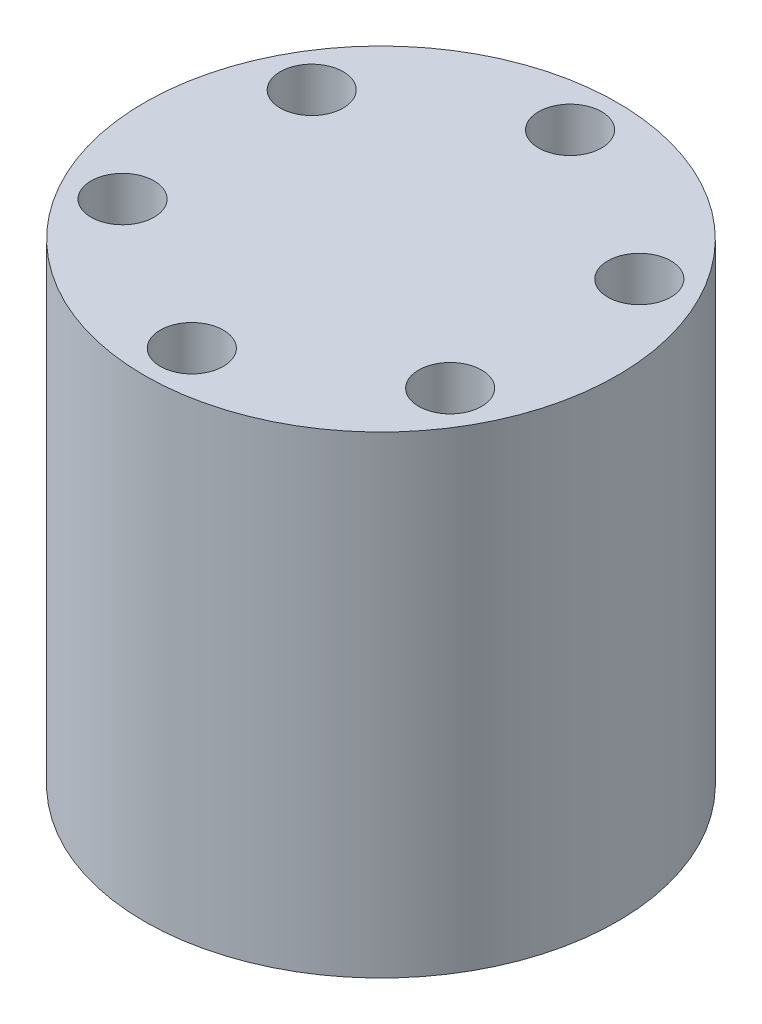
ISO-10303-21;
HEADER;
FILE_DESCRIPTION(('STEP AP214'),'2;1');
FILE_NAME('part.step','',(''),(''),'','','');
FILE_SCHEMA(('AUTOMOTIVE_DESIGN { 1 0 10303 214 1 1 1 1 }'));
ENDSEC;
DATA;
#1=APPLICATION_CONTEXT('core data for automotive mechanical design processes');
#2=APPLICATION_PROTOCOL_DEFINITION('international standard','automotive_design',2000,#1);
#3=PRODUCT_CONTEXT('',#1,'mechanical');
#4=PRODUCT('Part','Part','',(#3));
#5=PRODUCT_RELATED_PRODUCT_CATEGORY('part','',(#4));
#6=PRODUCT_DEFINITION_FORMATION('','',#4);
#7=PRODUCT_DEFINITION_CONTEXT('part definition',#1,'design');
#8=PRODUCT_DEFINITION('design','',#6,#7);
#9=PRODUCT_DEFINITION_SHAPE('','',#8);
#10=(LENGTH_UNIT() NAMED_UNIT(*) SI_UNIT(.MILLI.,.METRE.));
#11=(NAMED_UNIT(*) PLANE_ANGLE_UNIT() SI_UNIT($,.RADIAN.));
#12=(NAMED_UNIT(*) SI_UNIT($,.STERADIAN.) SOLID_ANGLE_UNIT());
#13=UNCERTAINTY_MEASURE_WITH_UNIT(LENGTH_MEASURE(1.E-05),#10,'distance_accuracy_value','');
#14=(GEOMETRIC_REPRESENTATION_CONTEXT(3) GLOBAL_UNCERTAINTY_ASSIGNED_CONTEXT((#13)) GLOBAL_UNIT_ASSIGNED_CONTEXT((#10,
#11,#12)) REPRESENTATION_CONTEXT('',''));
#15=CARTESIAN_POINT('',(0.,0.,0.));
#16=DIRECTION('',(0.,0.,1.));
#17=DIRECTION('',(1.,0.,0.));
#18=AXIS2_PLACEMENT_3D('',#15,#16,#17);
#19=CARTESIAN_POINT('',(0.,0.,0.));
#20=DIRECTION('',(0.,1.,0.));
#21=DIRECTION('',(0.,0.,1.));
#22=AXIS2_PLACEMENT_3D('',#19,#20,#21);
#23=PLANE('',#22);
#24=CARTESIAN_POINT('',(-10.3923048454132,0.,6.00000000000012));
#25=DIRECTION('',(0.,-1.,0.));
#26=DIRECTION('',(0.,0.,-1.));
#27=AXIS2_PLACEMENT_3D('',#24,#25,#26);
#28=CIRCLE('',#27,1.99999999999999);
#29=CARTESIAN_POINT('',(-10.3923048454132,0.,4.00000000000013));
#30=VERTEX_POINT('',#29);
#31=EDGE_CURVE('E89',#30,#30,#28,.T.);
#32=ORIENTED_EDGE('',*,*,#31,.F.);
#33=EDGE_LOOP('',(#32));
#34=FACE_BOUND('',#33,.T.);
#35=CARTESIAN_POINT('',(-10.3923048454133,0.,-5.9999999999999));
#36=DIRECTION('',(0.,-1.,0.));
#37=DIRECTION('',(0.,0.,-1.));
#38=AXIS2_PLACEMENT_3D('',#35,#36,#37);
#39=CIRCLE('',#38,1.99999999999999);
#40=CARTESIAN_POINT('',(-10.3923048454133,0.,-7.99999999999989));
#41=VERTEX_POINT('',#40);
#42=EDGE_CURVE('E83',#41,#41,#39,.T.);
#43=ORIENTED_EDGE('',*,*,#42,.F.);
#44=EDGE_LOOP('',(#43));
#45=FACE_BOUND('',#44,.T.);
#46=CARTESIAN_POINT('',(0.,0.,-12.));
#47=DIRECTION('',(0.,-1.,0.));
#48=DIRECTION('',(0.,0.,-1.));
#49=AXIS2_PLACEMENT_3D('',#46,#47,#48);
#50=CIRCLE('',#49,1.99999999999999);
#51=CARTESIAN_POINT('',(0.,0.,-14.));
#52=VERTEX_POINT('',#51);
#53=EDGE_CURVE('E77',#52,#52,#50,.T.);
#54=ORIENTED_EDGE('',*,*,#53,.F.);
#55=EDGE_LOOP('',(#54));
#56=FACE_BOUND('',#55,.T.);
#57=CARTESIAN_POINT('',(10.3923048454132,0.,-6.00000000000005));
#58=DIRECTION('',(0.,-1.,0.));
#59=DIRECTION('',(0.,0.,-1.));
#60=AXIS2_PLACEMENT_3D('',#57,#58,#59);
#61=CIRCLE('',#60,1.99999999999999);
#62=CARTESIAN_POINT('',(10.3923048454132,0.,-8.00000000000004));
#63=VERTEX_POINT('',#62);
#64=EDGE_CURVE('E71',#63,#63,#61,.T.);
#65=ORIENTED_EDGE('',*,*,#64,.F.);
#66=EDGE_LOOP('',(#65));
#67=FACE_BOUND('',#66,.T.);
#68=CARTESIAN_POINT('',(10.3923048454133,0.,5.99999999999998));
#69=DIRECTION('',(0.,-1.,0.));
#70=DIRECTION('',(0.,0.,-1.));
#71=AXIS2_PLACEMENT_3D('',#68,#69,#70);
#72=CIRCLE('',#71,1.99999999999999);
#73=CARTESIAN_POINT('',(10.3923048454133,0.,3.99999999999999));
#74=VERTEX_POINT('',#73);
#75=EDGE_CURVE('E65',#74,#74,#72,.T.);
#76=ORIENTED_EDGE('',*,*,#75,.F.);
#77=EDGE_LOOP('',(#76));
#78=FACE_BOUND('',#77,.T.);
#79=CARTESIAN_POINT('',(0.,0.,0.));
#80=DIRECTION('',(0.,-1.,0.));
#81=DIRECTION('',(0.,0.,-1.));
#82=AXIS2_PLACEMENT_3D('',#79,#80,#81);
#83=CIRCLE('',#82,7.);
#84=CARTESIAN_POINT('',(0.,0.,-7.));
#85=VERTEX_POINT('',#84);
#86=EDGE_CURVE('E10',#85,#85,#83,.T.);
#87=ORIENTED_EDGE('',*,*,#86,.F.);
#88=EDGE_LOOP('',(#87));
#89=FACE_BOUND('',#88,.T.);
#90=CARTESIAN_POINT('',(0.,0.,0.));
#91=DIRECTION('',(0.,1.,0.));
#92=DIRECTION('',(0.,0.,1.));
#93=AXIS2_PLACEMENT_3D('',#90,#91,#92);
#94=CIRCLE('',#93,15.);
#95=CARTESIAN_POINT('',(0.,0.,15.));
#96=VERTEX_POINT('',#95);
#97=EDGE_CURVE('E43',#96,#96,#94,.T.);
#98=ORIENTED_EDGE('',*,*,#97,.F.);
#99=EDGE_LOOP('',(#98));
#100=FACE_BOUND('',#99,.T.);
#101=CARTESIAN_POINT('',(0.,0.,12.));
#102=DIRECTION('',(0.,-1.,0.));
#103=DIRECTION('',(0.,0.,-1.));
#104=AXIS2_PLACEMENT_3D('',#101,#102,#103);
#105=CIRCLE('',#104,1.99999999999999);
#106=CARTESIAN_POINT('',(0.,0.,10.));
#107=VERTEX_POINT('',#106);
#108=EDGE_CURVE('E59',#107,#107,#105,.T.);
#109=ORIENTED_EDGE('',*,*,#108,.F.);
#110=EDGE_LOOP('',(#109));
#111=FACE_BOUND('',#110,.T.);
#112=ADVANCED_FACE('F39',(#34,#45,#56,#67,#78,#89,#100,#111),#23,.F.);
#113=CARTESIAN_POINT('',(0.,30.,0.));
#114=DIRECTION('',(0.,-1.,0.));
#115=DIRECTION('',(0.,0.,-1.));
#116=AXIS2_PLACEMENT_3D('',#113,#114,#115);
#117=CYLINDRICAL_SURFACE('',#116,15.);
#118=CARTESIAN_POINT('',(0.,30.,0.));
#119=DIRECTION('',(0.,1.,0.));
#120=DIRECTION('',(0.,0.,1.));
#121=AXIS2_PLACEMENT_3D('',#118,#119,#120);
#122=CIRCLE('',#121,15.);
#123=CARTESIAN_POINT('',(0.,30.,15.));
#124=VERTEX_POINT('',#123);
#125=EDGE_CURVE('E47',#124,#124,#122,.T.);
#126=ORIENTED_EDGE('',*,*,#125,.F.);
#127=EDGE_LOOP('',(#126));
#128=FACE_BOUND('',#127,.T.);
#129=ORIENTED_EDGE('',*,*,#97,.T.);
#130=EDGE_LOOP('',(#129));
#131=FACE_BOUND('',#130,.T.);
#132=ADVANCED_FACE('F41',(#128,#131),#117,.T.);
#133=CARTESIAN_POINT('',(0.,30.,0.));
#134=DIRECTION('',(0.,1.,0.));
#135=DIRECTION('',(0.,0.,1.));
#136=AXIS2_PLACEMENT_3D('',#133,#134,#135);
#137=PLANE('',#136);
#138=CARTESIAN_POINT('',(-10.3923048454132,30.,6.00000000000012));
#139=DIRECTION('',(0.,-1.,0.));
#140=DIRECTION('',(0.,0.,-1.));
#141=AXIS2_PLACEMENT_3D('',#138,#139,#140);
#142=CIRCLE('',#141,2.);
#143=CARTESIAN_POINT('',(-10.3923048454132,30.,4.00000000000013));
#144=VERTEX_POINT('',#143);
#145=EDGE_CURVE('E86',#144,#144,#142,.T.);
#146=ORIENTED_EDGE('',*,*,#145,.T.);
#147=EDGE_LOOP('',(#146));
#148=FACE_BOUND('',#147,.T.);
#149=CARTESIAN_POINT('',(-10.3923048454133,30.,-5.9999999999999));
#150=DIRECTION('',(0.,-1.,0.));
#151=DIRECTION('',(0.,0.,-1.));
#152=AXIS2_PLACEMENT_3D('',#149,#150,#151);
#153=CIRCLE('',#152,2.);
#154=CARTESIAN_POINT('',(-10.3923048454133,30.,-7.9999999999999));
#155=VERTEX_POINT('',#154);
#156=EDGE_CURVE('E80',#155,#155,#153,.T.);
#157=ORIENTED_EDGE('',*,*,#156,.T.);
#158=EDGE_LOOP('',(#157));
#159=FACE_BOUND('',#158,.T.);
#160=CARTESIAN_POINT('',(0.,30.,-12.));
#161=DIRECTION('',(0.,-1.,0.));
#162=DIRECTION('',(0.,0.,-1.));
#163=AXIS2_PLACEMENT_3D('',#160,#161,#162);
#164=CIRCLE('',#163,2.);
#165=CARTESIAN_POINT('',(0.,30.,-14.));
#166=VERTEX_POINT('',#165);
#167=EDGE_CURVE('E74',#166,#166,#164,.T.);
#168=ORIENTED_EDGE('',*,*,#167,.T.);
#169=EDGE_LOOP('',(#168));
#170=FACE_BOUND('',#169,.T.);
#171=CARTESIAN_POINT('',(10.3923048454132,30.,-6.00000000000005));
#172=DIRECTION('',(0.,-1.,0.));
#173=DIRECTION('',(0.,0.,-1.));
#174=AXIS2_PLACEMENT_3D('',#171,#172,#173);
#175=CIRCLE('',#174,2.);
#176=CARTESIAN_POINT('',(10.3923048454132,30.,-8.00000000000004));
#177=VERTEX_POINT('',#176);
#178=EDGE_CURVE('E68',#177,#177,#175,.T.);
#179=ORIENTED_EDGE('',*,*,#178,.T.);
#180=EDGE_LOOP('',(#179));
#181=FACE_BOUND('',#180,.T.);
#182=CARTESIAN_POINT('',(10.3923048454133,30.,5.99999999999998));
#183=DIRECTION('',(0.,-1.,0.));
#184=DIRECTION('',(0.,0.,-1.));
#185=AXIS2_PLACEMENT_3D('',#182,#183,#184);
#186=CIRCLE('',#185,2.);
#187=CARTESIAN_POINT('',(10.3923048454133,30.,3.99999999999998));
#188=VERTEX_POINT('',#187);
#189=EDGE_CURVE('E62',#188,#188,#186,.T.);
#190=ORIENTED_EDGE('',*,*,#189,.T.);
#191=EDGE_LOOP('',(#190));
#192=FACE_BOUND('',#191,.T.);
#193=CARTESIAN_POINT('',(0.,30.,12.));
#194=DIRECTION('',(0.,-1.,0.));
#195=DIRECTION('',(0.,0.,-1.));
#196=AXIS2_PLACEMENT_3D('',#193,#194,#195);
#197=CIRCLE('',#196,2.);
#198=CARTESIAN_POINT('',(0.,30.,10.));
#199=VERTEX_POINT('',#198);
#200=EDGE_CURVE('E56',#199,#199,#197,.T.);
#201=ORIENTED_EDGE('',*,*,#200,.T.);
#202=EDGE_LOOP('',(#201));
#203=FACE_BOUND('',#202,.T.);
#204=ORIENTED_EDGE('',*,*,#125,.T.);
#205=EDGE_LOOP('',(#204));
#206=FACE_BOUND('',#205,.T.);
#207=ADVANCED_FACE('F132',(#148,#159,#170,#181,#192,#203,#206),#137,.T.);
#208=CARTESIAN_POINT('',(0.,-4.,0.));
#209=DIRECTION('',(0.,1.,0.));
#210=DIRECTION('',(0.,0.,1.));
#211=AXIS2_PLACEMENT_3D('',#208,#209,#210);
#212=CYLINDRICAL_SURFACE('',#211,7.);
#213=CARTESIAN_POINT('',(0.,-4.,0.));
#214=DIRECTION('',(0.,-1.,0.));
#215=DIRECTION('',(0.,0.,-1.));
#216=AXIS2_PLACEMENT_3D('',#213,#214,#215);
#217=CIRCLE('',#216,7.);
#218=CARTESIAN_POINT('',(0.,-4.,-7.));
#219=VERTEX_POINT('',#218);
#220=EDGE_CURVE('E53',#219,#219,#217,.T.);
#221=ORIENTED_EDGE('',*,*,#220,.F.);
#222=EDGE_LOOP('',(#221));
#223=FACE_BOUND('',#222,.T.);
#224=ORIENTED_EDGE('',*,*,#86,.T.);
#225=EDGE_LOOP('',(#224));
#226=FACE_BOUND('',#225,.T.);
#227=ADVANCED_FACE('F124',(#223,#226),#212,.T.);
#228=CARTESIAN_POINT('',(0.,-4.,0.));
#229=DIRECTION('',(0.,-1.,0.));
#230=DIRECTION('',(0.,0.,-1.));
#231=AXIS2_PLACEMENT_3D('',#228,#229,#230);
#232=PLANE('',#231);
#233=ORIENTED_EDGE('',*,*,#220,.T.);
#234=EDGE_LOOP('',(#233));
#235=FACE_BOUND('',#234,.T.);
#236=ADVANCED_FACE('F114',(#235),#232,.T.);
#237=CARTESIAN_POINT('',(0.,0.,12.));
#238=DIRECTION('',(0.,-1.,0.));
#239=DIRECTION('',(0.,0.,-1.));
#240=AXIS2_PLACEMENT_3D('',#237,#238,#239);
#241=CYLINDRICAL_SURFACE('',#240,1.99999999999999);
#242=ORIENTED_EDGE('',*,*,#200,.F.);
#243=EDGE_LOOP('',(#242));
#244=FACE_BOUND('',#243,.T.);
#245=ORIENTED_EDGE('',*,*,#108,.T.);
#246=EDGE_LOOP('',(#245));
#247=FACE_BOUND('',#246,.T.);
#248=ADVANCED_FACE('F111',(#244,#247),#241,.F.);
#249=CARTESIAN_POINT('',(10.3923048454133,0.,5.99999999999998));
#250=DIRECTION('',(0.,-1.,0.));
#251=DIRECTION('',(0.,0.,-1.));
#252=AXIS2_PLACEMENT_3D('',#249,#250,#251);
#253=CYLINDRICAL_SURFACE('',#252,1.99999999999999);
#254=ORIENTED_EDGE('',*,*,#189,.F.);
#255=EDGE_LOOP('',(#254));
#256=FACE_BOUND('',#255,.T.);
#257=ORIENTED_EDGE('',*,*,#75,.T.);
#258=EDGE_LOOP('',(#257));
#259=FACE_BOUND('',#258,.T.);
#260=ADVANCED_FACE('F113',(#256,#259),#253,.F.);
#261=CARTESIAN_POINT('',(10.3923048454132,0.,-6.00000000000005));
#262=DIRECTION('',(0.,-1.,0.));
#263=DIRECTION('',(0.,0.,-1.));
#264=AXIS2_PLACEMENT_3D('',#261,#262,#263);
#265=CYLINDRICAL_SURFACE('',#264,1.99999999999999);
#266=ORIENTED_EDGE('',*,*,#178,.F.);
#267=EDGE_LOOP('',(#266));
#268=FACE_BOUND('',#267,.T.);
#269=ORIENTED_EDGE('',*,*,#64,.T.);
#270=EDGE_LOOP('',(#269));
#271=FACE_BOUND('',#270,.T.);
#272=ADVANCED_FACE('F121',(#268,#271),#265,.F.);
#273=CARTESIAN_POINT('',(0.,0.,-12.));
#274=DIRECTION('',(0.,-1.,0.));
#275=DIRECTION('',(0.,0.,-1.));
#276=AXIS2_PLACEMENT_3D('',#273,#274,#275);
#277=CYLINDRICAL_SURFACE('',#276,1.99999999999999);
#278=ORIENTED_EDGE('',*,*,#167,.F.);
#279=EDGE_LOOP('',(#278));
#280=FACE_BOUND('',#279,.T.);
#281=ORIENTED_EDGE('',*,*,#53,.T.);
#282=EDGE_LOOP('',(#281));
#283=FACE_BOUND('',#282,.T.);
#284=ADVANCED_FACE('F157',(#280,#283),#277,.F.);
#285=CARTESIAN_POINT('',(-10.3923048454133,0.,-5.9999999999999));
#286=DIRECTION('',(0.,-1.,0.));
#287=DIRECTION('',(0.,0.,-1.));
#288=AXIS2_PLACEMENT_3D('',#285,#286,#287);
#289=CYLINDRICAL_SURFACE('',#288,1.99999999999999);
#290=ORIENTED_EDGE('',*,*,#156,.F.);
#291=EDGE_LOOP('',(#290));
#292=FACE_BOUND('',#291,.T.);
#293=ORIENTED_EDGE('',*,*,#42,.T.);
#294=EDGE_LOOP('',(#293));
#295=FACE_BOUND('',#294,.T.);
#296=ADVANCED_FACE('F161',(#292,#295),#289,.F.);
#297=CARTESIAN_POINT('',(-10.3923048454132,0.,6.00000000000012));
#298=DIRECTION('',(0.,-1.,0.));
#299=DIRECTION('',(0.,0.,-1.));
#300=AXIS2_PLACEMENT_3D('',#297,#298,#299);
#301=CYLINDRICAL_SURFACE('',#300,1.99999999999999);
#302=ORIENTED_EDGE('',*,*,#145,.F.);
#303=EDGE_LOOP('',(#302));
#304=FACE_BOUND('',#303,.T.);
#305=ORIENTED_EDGE('',*,*,#31,.T.);
#306=EDGE_LOOP('',(#305));
#307=FACE_BOUND('',#306,.T.);
#308=ADVANCED_FACE('F93',(#304,#307),#301,.F.);
#309=CLOSED_SHELL('',(#112,#132,#207,#227,#236,#248,#260,#272,#284,#296,#308));
#310=MANIFOLD_SOLID_BREP('B2',#309);
#311=ADVANCED_BREP_SHAPE_REPRESENTATION('',(#18,#310),#14);
#312=SHAPE_DEFINITION_REPRESENTATION(#9,#311);
ENDSEC;
END-ISO-10303-21;
